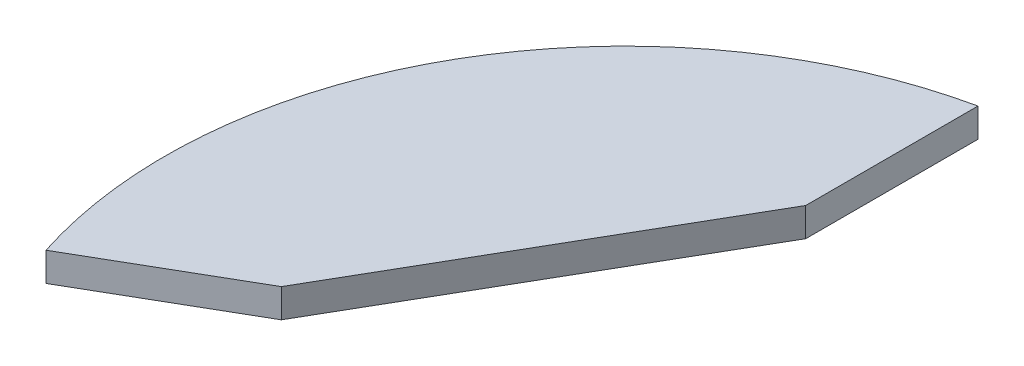
ISO-10303-21;
HEADER;
FILE_DESCRIPTION(('STEP AP214'),'2;1');
FILE_NAME('part.step','',(''),(''),'','','');
FILE_SCHEMA(('AUTOMOTIVE_DESIGN { 1 0 10303 214 1 1 1 1 }'));
ENDSEC;
DATA;
#1=APPLICATION_CONTEXT('core data for automotive mechanical design processes');
#2=APPLICATION_PROTOCOL_DEFINITION('international standard','automotive_design',2000,#1);
#3=PRODUCT_CONTEXT('',#1,'mechanical');
#4=PRODUCT('Part','Part','',(#3));
#5=PRODUCT_RELATED_PRODUCT_CATEGORY('part','',(#4));
#6=PRODUCT_DEFINITION_FORMATION('','',#4);
#7=PRODUCT_DEFINITION_CONTEXT('part definition',#1,'design');
#8=PRODUCT_DEFINITION('design','',#6,#7);
#9=PRODUCT_DEFINITION_SHAPE('','',#8);
#10=(LENGTH_UNIT() NAMED_UNIT(*) SI_UNIT(.MILLI.,.METRE.));
#11=(NAMED_UNIT(*) PLANE_ANGLE_UNIT() SI_UNIT($,.RADIAN.));
#12=(NAMED_UNIT(*) SI_UNIT($,.STERADIAN.) SOLID_ANGLE_UNIT());
#13=UNCERTAINTY_MEASURE_WITH_UNIT(LENGTH_MEASURE(1.E-05),#10,'distance_accuracy_value','');
#14=(GEOMETRIC_REPRESENTATION_CONTEXT(3) GLOBAL_UNCERTAINTY_ASSIGNED_CONTEXT((#13)) GLOBAL_UNIT_ASSIGNED_CONTEXT((#10,
#11,#12)) REPRESENTATION_CONTEXT('',''));
#15=CARTESIAN_POINT('',(0.,0.,0.));
#16=DIRECTION('',(0.,0.,1.));
#17=DIRECTION('',(1.,0.,0.));
#18=AXIS2_PLACEMENT_3D('',#15,#16,#17);
#19=CARTESIAN_POINT('',(0.,3.175,0.));
#20=DIRECTION('',(0.,-1.,0.));
#21=DIRECTION('',(0.,0.,-1.));
#22=AXIS2_PLACEMENT_3D('',#19,#20,#21);
#23=CYLINDRICAL_SURFACE('',#22,50.8);
#24=CARTESIAN_POINT('',(0.,0.,0.));
#25=DIRECTION('',(0.,1.,0.));
#26=DIRECTION('',(0.,0.,1.));
#27=AXIS2_PLACEMENT_3D('',#24,#25,#26);
#28=CIRCLE('',#27,50.8);
#29=CARTESIAN_POINT('',(-10.7442,0.,-49.6508022730751));
#30=VERTEX_POINT('',#29);
#31=CARTESIAN_POINT('',(-48.3709560867612,0.,15.5206509931967));
#32=VERTEX_POINT('',#31);
#33=EDGE_CURVE('E98',#30,#32,#28,.T.);
#34=ORIENTED_EDGE('',*,*,#33,.T.);
#35=DIRECTION('',(0.,-1.,0.));
#36=VECTOR('',#35,1.);
#37=CARTESIAN_POINT('',(-48.3709560867612,3.175,15.5206509931967));
#38=LINE('',#37,#36);
#39=CARTESIAN_POINT('',(-48.3709560867612,3.175,15.5206509931967));
#40=VERTEX_POINT('',#39);
#41=EDGE_CURVE('E11',#40,#32,#38,.T.);
#42=ORIENTED_EDGE('',*,*,#41,.F.);
#43=CARTESIAN_POINT('',(0.,3.175,0.));
#44=DIRECTION('',(0.,1.,0.));
#45=DIRECTION('',(0.,0.,1.));
#46=AXIS2_PLACEMENT_3D('',#43,#44,#45);
#47=CIRCLE('',#46,50.8);
#48=CARTESIAN_POINT('',(-10.7442,3.175,-49.6508022730751));
#49=VERTEX_POINT('',#48);
#50=EDGE_CURVE('E86',#49,#40,#47,.T.);
#51=ORIENTED_EDGE('',*,*,#50,.F.);
#52=DIRECTION('',(0.,-1.,0.));
#53=VECTOR('',#52,1.);
#54=CARTESIAN_POINT('',(-10.7442,3.175,-49.6508022730751));
#55=LINE('',#54,#53);
#56=EDGE_CURVE('E94',#49,#30,#55,.T.);
#57=ORIENTED_EDGE('',*,*,#56,.T.);
#58=EDGE_LOOP('',(#34,#42,#51,#57));
#59=FACE_BOUND('',#58,.T.);
#60=ADVANCED_FACE('F35',(#59),#23,.T.);
#61=CARTESIAN_POINT('',(-31.9164734148569,3.175,6.02065099319672));
#62=DIRECTION('',(-0.499999999999998,0.,-0.86602540378444));
#63=DIRECTION('',(-0.86602540378444,0.,0.499999999999998));
#64=AXIS2_PLACEMENT_3D('',#61,#62,#63);
#65=PLANE('',#64);
#66=DIRECTION('',(0.86602540378444,0.,-0.499999999999998));
#67=VECTOR('',#66,1.);
#68=CARTESIAN_POINT('',(-31.9164734148569,0.,6.02065099319672));
#69=LINE('',#68,#67);
#70=CARTESIAN_POINT('',(-31.9164734148569,0.,6.02065099319672));
#71=VERTEX_POINT('',#70);
#72=EDGE_CURVE('E90',#32,#71,#69,.T.);
#73=ORIENTED_EDGE('',*,*,#72,.T.);
#74=DIRECTION('',(0.,-1.,0.));
#75=VECTOR('',#74,1.);
#76=CARTESIAN_POINT('',(-31.9164734148569,3.175,6.02065099319672));
#77=LINE('',#76,#75);
#78=CARTESIAN_POINT('',(-31.9164734148569,3.175,6.02065099319672));
#79=VERTEX_POINT('',#78);
#80=EDGE_CURVE('E43',#79,#71,#77,.T.);
#81=ORIENTED_EDGE('',*,*,#80,.F.);
#82=DIRECTION('',(0.86602540378444,0.,-0.499999999999998));
#83=VECTOR('',#82,1.);
#84=CARTESIAN_POINT('',(-31.9164734148569,3.175,6.02065099319672));
#85=LINE('',#84,#83);
#86=EDGE_CURVE('E81',#40,#79,#85,.T.);
#87=ORIENTED_EDGE('',*,*,#86,.F.);
#88=ORIENTED_EDGE('',*,*,#41,.T.);
#89=EDGE_LOOP('',(#73,#81,#87,#88));
#90=FACE_BOUND('',#89,.T.);
#91=ADVANCED_FACE('F89',(#90),#65,.F.);
#92=CARTESIAN_POINT('',(-31.9164734148569,3.175,6.02065099319672));
#93=DIRECTION('',(-0.866025403784438,0.,-0.500000000000001));
#94=DIRECTION('',(-0.500000000000001,0.,0.866025403784438));
#95=AXIS2_PLACEMENT_3D('',#92,#93,#94);
#96=PLANE('',#95);
#97=DIRECTION('',(0.500000000000001,0.,-0.866025403784438));
#98=VECTOR('',#97,1.);
#99=CARTESIAN_POINT('',(-31.9164734148569,0.,6.02065099319672));
#100=LINE('',#99,#98);
#101=CARTESIAN_POINT('',(-10.7442,0.,-30.6508022730751));
#102=VERTEX_POINT('',#101);
#103=EDGE_CURVE('E68',#71,#102,#100,.T.);
#104=ORIENTED_EDGE('',*,*,#103,.T.);
#105=DIRECTION('',(0.,-1.,0.));
#106=VECTOR('',#105,1.);
#107=CARTESIAN_POINT('',(-10.7442,3.175,-30.6508022730751));
#108=LINE('',#107,#106);
#109=CARTESIAN_POINT('',(-10.7442,3.175,-30.6508022730751));
#110=VERTEX_POINT('',#109);
#111=EDGE_CURVE('E91',#110,#102,#108,.T.);
#112=ORIENTED_EDGE('',*,*,#111,.F.);
#113=DIRECTION('',(0.500000000000001,0.,-0.866025403784438));
#114=VECTOR('',#113,1.);
#115=CARTESIAN_POINT('',(-31.9164734148569,3.175,6.02065099319672));
#116=LINE('',#115,#114);
#117=EDGE_CURVE('E84',#79,#110,#116,.T.);
#118=ORIENTED_EDGE('',*,*,#117,.F.);
#119=ORIENTED_EDGE('',*,*,#80,.T.);
#120=EDGE_LOOP('',(#104,#112,#118,#119));
#121=FACE_BOUND('',#120,.T.);
#122=ADVANCED_FACE('F92',(#121),#96,.F.);
#123=CARTESIAN_POINT('',(-10.7442,3.175,-49.6508022730751));
#124=DIRECTION('',(-1.,0.,0.));
#125=DIRECTION('',(0.,0.,1.));
#126=AXIS2_PLACEMENT_3D('',#123,#124,#125);
#127=PLANE('',#126);
#128=DIRECTION('',(0.,0.,-1.));
#129=VECTOR('',#128,1.);
#130=CARTESIAN_POINT('',(-10.7442,0.,-49.6508022730751));
#131=LINE('',#130,#129);
#132=EDGE_CURVE('E74',#102,#30,#131,.T.);
#133=ORIENTED_EDGE('',*,*,#132,.T.);
#134=ORIENTED_EDGE('',*,*,#56,.F.);
#135=DIRECTION('',(0.,0.,-1.));
#136=VECTOR('',#135,1.);
#137=CARTESIAN_POINT('',(-10.7442,3.175,-49.6508022730751));
#138=LINE('',#137,#136);
#139=EDGE_CURVE('E51',#110,#49,#138,.T.);
#140=ORIENTED_EDGE('',*,*,#139,.F.);
#141=ORIENTED_EDGE('',*,*,#111,.T.);
#142=EDGE_LOOP('',(#133,#134,#140,#141));
#143=FACE_BOUND('',#142,.T.);
#144=ADVANCED_FACE('F105',(#143),#127,.F.);
#145=CARTESIAN_POINT('',(0.,3.175,0.));
#146=DIRECTION('',(0.,1.,0.));
#147=DIRECTION('',(0.,0.,1.));
#148=AXIS2_PLACEMENT_3D('',#145,#146,#147);
#149=PLANE('',#148);
#150=ORIENTED_EDGE('',*,*,#50,.T.);
#151=ORIENTED_EDGE('',*,*,#86,.T.);
#152=ORIENTED_EDGE('',*,*,#117,.T.);
#153=ORIENTED_EDGE('',*,*,#139,.T.);
#154=EDGE_LOOP('',(#150,#151,#152,#153));
#155=FACE_BOUND('',#154,.T.);
#156=ADVANCED_FACE('F82',(#155),#149,.T.);
#157=CARTESIAN_POINT('',(0.,0.,0.));
#158=DIRECTION('',(0.,1.,0.));
#159=DIRECTION('',(0.,0.,1.));
#160=AXIS2_PLACEMENT_3D('',#157,#158,#159);
#161=PLANE('',#160);
#162=ORIENTED_EDGE('',*,*,#33,.F.);
#163=ORIENTED_EDGE('',*,*,#132,.F.);
#164=ORIENTED_EDGE('',*,*,#103,.F.);
#165=ORIENTED_EDGE('',*,*,#72,.F.);
#166=EDGE_LOOP('',(#162,#163,#164,#165));
#167=FACE_BOUND('',#166,.T.);
#168=ADVANCED_FACE('F108',(#167),#161,.F.);
#169=CLOSED_SHELL('',(#60,#91,#122,#144,#156,#168));
#170=MANIFOLD_SOLID_BREP('B2',#169);
#171=ADVANCED_BREP_SHAPE_REPRESENTATION('',(#18,#170),#14);
#172=SHAPE_DEFINITION_REPRESENTATION(#9,#171);
ENDSEC;
END-ISO-10303-21;
